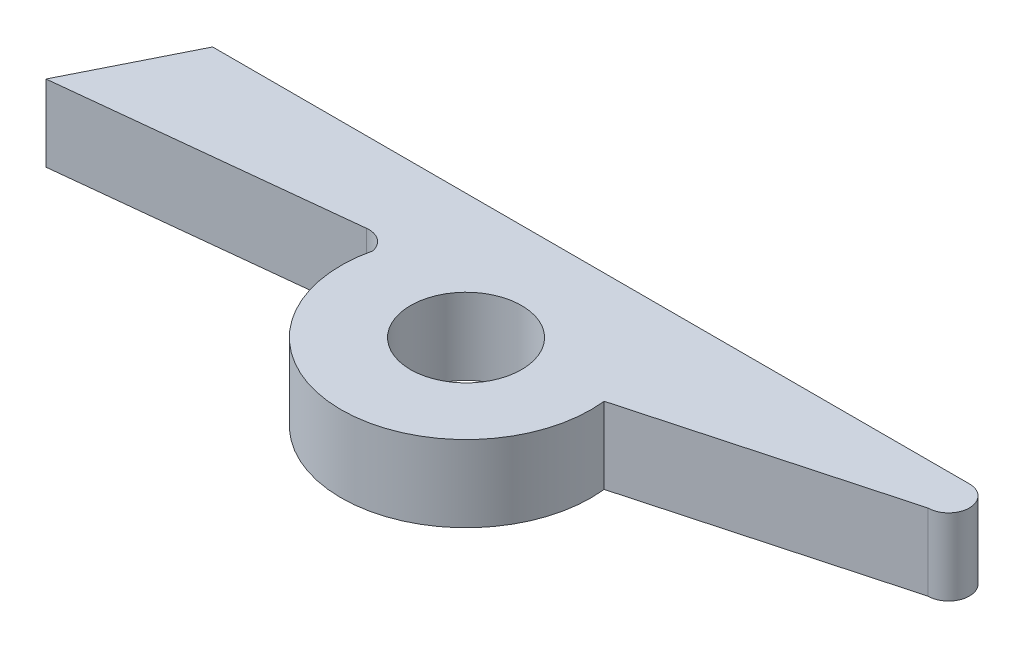
ISO-10303-21;
HEADER;
FILE_DESCRIPTION(('STEP AP214'),'2;1');
FILE_NAME('part.step','',(''),(''),'','','');
FILE_SCHEMA(('AUTOMOTIVE_DESIGN { 1 0 10303 214 1 1 1 1 }'));
ENDSEC;
DATA;
#1=APPLICATION_CONTEXT('core data for automotive mechanical design processes');
#2=APPLICATION_PROTOCOL_DEFINITION('international standard','automotive_design',2000,#1);
#3=PRODUCT_CONTEXT('',#1,'mechanical');
#4=PRODUCT('Part','Part','',(#3));
#5=PRODUCT_RELATED_PRODUCT_CATEGORY('part','',(#4));
#6=PRODUCT_DEFINITION_FORMATION('','',#4);
#7=PRODUCT_DEFINITION_CONTEXT('part definition',#1,'design');
#8=PRODUCT_DEFINITION('design','',#6,#7);
#9=PRODUCT_DEFINITION_SHAPE('','',#8);
#10=(LENGTH_UNIT() NAMED_UNIT(*) SI_UNIT(.MILLI.,.METRE.));
#11=(NAMED_UNIT(*) PLANE_ANGLE_UNIT() SI_UNIT($,.RADIAN.));
#12=(NAMED_UNIT(*) SI_UNIT($,.STERADIAN.) SOLID_ANGLE_UNIT());
#13=UNCERTAINTY_MEASURE_WITH_UNIT(LENGTH_MEASURE(1.E-05),#10,'distance_accuracy_value','');
#14=(GEOMETRIC_REPRESENTATION_CONTEXT(3) GLOBAL_UNCERTAINTY_ASSIGNED_CONTEXT((#13)) GLOBAL_UNIT_ASSIGNED_CONTEXT((#10,
#11,#12)) REPRESENTATION_CONTEXT('',''));
#15=CARTESIAN_POINT('',(0.,0.,0.));
#16=DIRECTION('',(0.,0.,1.));
#17=DIRECTION('',(1.,0.,0.));
#18=AXIS2_PLACEMENT_3D('',#15,#16,#17);
#19=CARTESIAN_POINT('',(0.36626721934757,5.5,1.3412705572508));
#20=DIRECTION('',(0.263429454612286,0.,0.964678662790192));
#21=DIRECTION('',(0.964678662790192,0.,-0.263429454612286));
#22=AXIS2_PLACEMENT_3D('',#19,#20,#21);
#23=PLANE('',#22);
#24=DIRECTION('',(-0.964678662790192,0.,0.263429454612286));
#25=VECTOR('',#24,1.);
#26=CARTESIAN_POINT('',(0.36626721934757,0.,1.3412705572508));
#27=LINE('',#26,#25);
#28=CARTESIAN_POINT('',(27.25,0.,-6.));
#29=VERTEX_POINT('',#28);
#30=CARTESIAN_POINT('',(8.94414527922395,0.,-1.0011319713883));
#31=VERTEX_POINT('',#30);
#32=EDGE_CURVE('E127',#29,#31,#27,.T.);
#33=ORIENTED_EDGE('',*,*,#32,.F.);
#34=DIRECTION('',(0.,-1.,0.));
#35=VECTOR('',#34,1.);
#36=CARTESIAN_POINT('',(27.25,5.5,-6.));
#37=LINE('',#36,#35);
#38=CARTESIAN_POINT('',(27.25,5.5,-6.));
#39=VERTEX_POINT('',#38);
#40=EDGE_CURVE('E11',#39,#29,#37,.T.);
#41=ORIENTED_EDGE('',*,*,#40,.F.);
#42=DIRECTION('',(-0.964678662790192,0.,0.263429454612286));
#43=VECTOR('',#42,1.);
#44=CARTESIAN_POINT('',(0.36626721934757,5.5,1.3412705572508));
#45=LINE('',#44,#43);
#46=CARTESIAN_POINT('',(8.94414527922395,5.5,-1.0011319713883));
#47=VERTEX_POINT('',#46);
#48=EDGE_CURVE('E165',#39,#47,#45,.T.);
#49=ORIENTED_EDGE('',*,*,#48,.T.);
#50=DIRECTION('',(0.,-1.,0.));
#51=VECTOR('',#50,1.);
#52=CARTESIAN_POINT('',(8.94414527922395,5.5,-1.0011319713883));
#53=LINE('',#52,#51);
#54=EDGE_CURVE('E83',#47,#31,#53,.T.);
#55=ORIENTED_EDGE('',*,*,#54,.T.);
#56=EDGE_LOOP('',(#33,#41,#49,#55));
#57=FACE_BOUND('',#56,.T.);
#58=ADVANCED_FACE('F35',(#57),#23,.T.);
#59=CARTESIAN_POINT('',(27.25,5.5,-7.5));
#60=DIRECTION('',(0.,-1.,0.));
#61=DIRECTION('',(0.,0.,-1.));
#62=AXIS2_PLACEMENT_3D('',#59,#60,#61);
#63=CYLINDRICAL_SURFACE('',#62,1.5);
#64=CARTESIAN_POINT('',(27.25,0.,-7.5));
#65=DIRECTION('',(0.,1.,0.));
#66=DIRECTION('',(0.,0.,1.));
#67=AXIS2_PLACEMENT_3D('',#64,#65,#66);
#68=CIRCLE('',#67,1.5);
#69=CARTESIAN_POINT('',(27.25,0.,-9.));
#70=VERTEX_POINT('',#69);
#71=EDGE_CURVE('E130',#29,#70,#68,.T.);
#72=ORIENTED_EDGE('',*,*,#71,.T.);
#73=DIRECTION('',(0.,-1.,0.));
#74=VECTOR('',#73,1.);
#75=CARTESIAN_POINT('',(27.25,5.5,-9.));
#76=LINE('',#75,#74);
#77=CARTESIAN_POINT('',(27.25,5.5,-9.));
#78=VERTEX_POINT('',#77);
#79=EDGE_CURVE('E44',#78,#70,#76,.T.);
#80=ORIENTED_EDGE('',*,*,#79,.F.);
#81=CARTESIAN_POINT('',(27.25,5.5,-7.5));
#82=DIRECTION('',(0.,1.,0.));
#83=DIRECTION('',(0.,0.,1.));
#84=AXIS2_PLACEMENT_3D('',#81,#82,#83);
#85=CIRCLE('',#84,1.5);
#86=EDGE_CURVE('E163',#39,#78,#85,.T.);
#87=ORIENTED_EDGE('',*,*,#86,.F.);
#88=ORIENTED_EDGE('',*,*,#40,.T.);
#89=EDGE_LOOP('',(#72,#80,#87,#88));
#90=FACE_BOUND('',#89,.T.);
#91=ADVANCED_FACE('F157',(#90),#63,.T.);
#92=CARTESIAN_POINT('',(0.,5.5,-9.));
#93=DIRECTION('',(0.,0.,-1.));
#94=DIRECTION('',(-1.,0.,0.));
#95=AXIS2_PLACEMENT_3D('',#92,#93,#94);
#96=PLANE('',#95);
#97=DIRECTION('',(1.,0.,0.));
#98=VECTOR('',#97,1.);
#99=CARTESIAN_POINT('',(0.,0.,-9.));
#100=LINE('',#99,#98);
#101=CARTESIAN_POINT('',(-27.25,0.,-9.));
#102=VERTEX_POINT('',#101);
#103=EDGE_CURVE('E133',#102,#70,#100,.T.);
#104=ORIENTED_EDGE('',*,*,#103,.F.);
#105=DIRECTION('',(0.,-1.,0.));
#106=VECTOR('',#105,1.);
#107=CARTESIAN_POINT('',(-27.25,5.5,-9.));
#108=LINE('',#107,#106);
#109=CARTESIAN_POINT('',(-27.25,5.5,-9.));
#110=VERTEX_POINT('',#109);
#111=EDGE_CURVE('E148',#110,#102,#108,.T.);
#112=ORIENTED_EDGE('',*,*,#111,.F.);
#113=DIRECTION('',(1.,0.,0.));
#114=VECTOR('',#113,1.);
#115=CARTESIAN_POINT('',(0.,5.5,-9.));
#116=LINE('',#115,#114);
#117=EDGE_CURVE('E154',#110,#78,#116,.T.);
#118=ORIENTED_EDGE('',*,*,#117,.T.);
#119=ORIENTED_EDGE('',*,*,#79,.T.);
#120=EDGE_LOOP('',(#104,#112,#118,#119));
#121=FACE_BOUND('',#120,.T.);
#122=ADVANCED_FACE('F153',(#121),#96,.T.);
#123=CARTESIAN_POINT('',(-25.4,5.5,-12.7));
#124=DIRECTION('',(-0.894427190999916,0.,-0.447213595499958));
#125=DIRECTION('',(-0.447213595499958,0.,0.894427190999916));
#126=AXIS2_PLACEMENT_3D('',#123,#124,#125);
#127=PLANE('',#126);
#128=DIRECTION('',(0.447213595499958,0.,-0.894427190999916));
#129=VECTOR('',#128,1.);
#130=CARTESIAN_POINT('',(-25.4,0.,-12.7));
#131=LINE('',#130,#129);
#132=CARTESIAN_POINT('',(-31.25,0.,-1.));
#133=VERTEX_POINT('',#132);
#134=EDGE_CURVE('E136',#133,#102,#131,.T.);
#135=ORIENTED_EDGE('',*,*,#134,.F.);
#136=DIRECTION('',(0.,-1.,0.));
#137=VECTOR('',#136,1.);
#138=CARTESIAN_POINT('',(-31.25,5.5,-1.));
#139=LINE('',#138,#137);
#140=CARTESIAN_POINT('',(-31.25,5.5,-1.));
#141=VERTEX_POINT('',#140);
#142=EDGE_CURVE('E110',#141,#133,#139,.T.);
#143=ORIENTED_EDGE('',*,*,#142,.F.);
#144=DIRECTION('',(0.447213595499958,0.,-0.894427190999916));
#145=VECTOR('',#144,1.);
#146=CARTESIAN_POINT('',(-25.4,5.5,-12.7));
#147=LINE('',#146,#145);
#148=EDGE_CURVE('E117',#141,#110,#147,.T.);
#149=ORIENTED_EDGE('',*,*,#148,.T.);
#150=ORIENTED_EDGE('',*,*,#111,.T.);
#151=EDGE_LOOP('',(#135,#143,#149,#150));
#152=FACE_BOUND('',#151,.T.);
#153=ADVANCED_FACE('F162',(#152),#127,.T.);
#154=CARTESIAN_POINT('',(-0.459312437672505,5.5,-4.29375088294753));
#155=DIRECTION('',(0.106365464144769,0.,0.994327103139238));
#156=DIRECTION('',(0.994327103139238,0.,-0.106365464144769));
#157=AXIS2_PLACEMENT_3D('',#154,#155,#156);
#158=PLANE('',#157);
#159=DIRECTION('',(-0.994327103139238,0.,0.106365464144769));
#160=VECTOR('',#159,1.);
#161=CARTESIAN_POINT('',(-0.459312437672505,0.,-4.29375088294753));
#162=LINE('',#161,#160);
#163=CARTESIAN_POINT('',(-10.3895481962172,0.,-3.23149065470886));
#164=VERTEX_POINT('',#163);
#165=EDGE_CURVE('E105',#164,#133,#162,.T.);
#166=ORIENTED_EDGE('',*,*,#165,.F.);
#167=DIRECTION('',(0.,-1.,0.));
#168=VECTOR('',#167,1.);
#169=CARTESIAN_POINT('',(-10.3895481962172,5.5,-3.23149065470886));
#170=LINE('',#169,#168);
#171=CARTESIAN_POINT('',(-10.3895481962172,5.5,-3.23149065470886));
#172=VERTEX_POINT('',#171);
#173=EDGE_CURVE('E100',#172,#164,#170,.T.);
#174=ORIENTED_EDGE('',*,*,#173,.F.);
#175=DIRECTION('',(-0.994327103139238,0.,0.106365464144769));
#176=VECTOR('',#175,1.);
#177=CARTESIAN_POINT('',(-0.459312437672505,5.5,-4.29375088294753));
#178=LINE('',#177,#176);
#179=EDGE_CURVE('E103',#172,#141,#178,.T.);
#180=ORIENTED_EDGE('',*,*,#179,.T.);
#181=ORIENTED_EDGE('',*,*,#142,.T.);
#182=EDGE_LOOP('',(#166,#174,#180,#181));
#183=FACE_BOUND('',#182,.T.);
#184=ADVANCED_FACE('F102',(#183),#158,.T.);
#185=CARTESIAN_POINT('',(-10.23,5.5,-1.74));
#186=DIRECTION('',(0.,-1.,0.));
#187=DIRECTION('',(0.,0.,-1.));
#188=AXIS2_PLACEMENT_3D('',#185,#186,#187);
#189=CYLINDRICAL_SURFACE('',#188,1.5);
#190=CARTESIAN_POINT('',(-10.23,0.,-1.74));
#191=DIRECTION('',(0.,1.,0.));
#192=DIRECTION('',(0.,0.,1.));
#193=AXIS2_PLACEMENT_3D('',#190,#191,#192);
#194=CIRCLE('',#193,1.5);
#195=CARTESIAN_POINT('',(-8.76287503754572,0.,-2.05232089994671));
#196=VERTEX_POINT('',#195);
#197=EDGE_CURVE('E140',#196,#164,#194,.T.);
#198=ORIENTED_EDGE('',*,*,#197,.F.);
#199=DIRECTION('',(0.,-1.,0.));
#200=VECTOR('',#199,1.);
#201=CARTESIAN_POINT('',(-8.76287503754572,5.5,-2.05232089994671));
#202=LINE('',#201,#200);
#203=CARTESIAN_POINT('',(-8.76287503754572,5.5,-2.05232089994671));
#204=VERTEX_POINT('',#203);
#205=EDGE_CURVE('E76',#204,#196,#202,.T.);
#206=ORIENTED_EDGE('',*,*,#205,.F.);
#207=CARTESIAN_POINT('',(-10.23,5.5,-1.74));
#208=DIRECTION('',(0.,1.,0.));
#209=DIRECTION('',(0.,0.,1.));
#210=AXIS2_PLACEMENT_3D('',#207,#208,#209);
#211=CIRCLE('',#210,1.5);
#212=EDGE_CURVE('E114',#204,#172,#211,.T.);
#213=ORIENTED_EDGE('',*,*,#212,.T.);
#214=ORIENTED_EDGE('',*,*,#173,.T.);
#215=EDGE_LOOP('',(#198,#206,#213,#214));
#216=FACE_BOUND('',#215,.T.);
#217=ADVANCED_FACE('F119',(#216),#189,.F.);
#218=CARTESIAN_POINT('',(0.,5.5,0.));
#219=DIRECTION('',(0.,-1.,0.));
#220=DIRECTION('',(0.,0.,-1.));
#221=AXIS2_PLACEMENT_3D('',#218,#219,#220);
#222=CYLINDRICAL_SURFACE('',#221,4.);
#223=CARTESIAN_POINT('',(0.,5.5,0.));
#224=DIRECTION('',(0.,1.,0.));
#225=DIRECTION('',(0.,0.,1.));
#226=AXIS2_PLACEMENT_3D('',#223,#224,#225);
#227=CIRCLE('',#226,4.);
#228=CARTESIAN_POINT('',(0.,5.5,4.));
#229=VERTEX_POINT('',#228);
#230=EDGE_CURVE('E144',#229,#229,#227,.T.);
#231=ORIENTED_EDGE('',*,*,#230,.T.);
#232=EDGE_LOOP('',(#231));
#233=FACE_BOUND('',#232,.T.);
#234=CARTESIAN_POINT('',(0.,0.,0.));
#235=DIRECTION('',(0.,1.,0.));
#236=DIRECTION('',(0.,0.,1.));
#237=AXIS2_PLACEMENT_3D('',#234,#235,#236);
#238=CIRCLE('',#237,4.);
#239=CARTESIAN_POINT('',(0.,0.,4.));
#240=VERTEX_POINT('',#239);
#241=EDGE_CURVE('E124',#240,#240,#238,.T.);
#242=ORIENTED_EDGE('',*,*,#241,.F.);
#243=EDGE_LOOP('',(#242));
#244=FACE_BOUND('',#243,.T.);
#245=ADVANCED_FACE('F37',(#233,#244),#222,.F.);
#246=CARTESIAN_POINT('',(0.,5.5,0.));
#247=DIRECTION('',(0.,-1.,0.));
#248=DIRECTION('',(0.,0.,-1.));
#249=AXIS2_PLACEMENT_3D('',#246,#247,#248);
#250=CYLINDRICAL_SURFACE('',#249,9.);
#251=CARTESIAN_POINT('',(0.,0.,0.));
#252=DIRECTION('',(0.,1.,0.));
#253=DIRECTION('',(0.,0.,1.));
#254=AXIS2_PLACEMENT_3D('',#251,#252,#253);
#255=CIRCLE('',#254,9.);
#256=EDGE_CURVE('E142',#196,#31,#255,.T.);
#257=ORIENTED_EDGE('',*,*,#256,.T.);
#258=ORIENTED_EDGE('',*,*,#54,.F.);
#259=CARTESIAN_POINT('',(0.,5.5,0.));
#260=DIRECTION('',(0.,1.,0.));
#261=DIRECTION('',(0.,0.,1.));
#262=AXIS2_PLACEMENT_3D('',#259,#260,#261);
#263=CIRCLE('',#262,9.);
#264=EDGE_CURVE('E52',#204,#47,#263,.T.);
#265=ORIENTED_EDGE('',*,*,#264,.F.);
#266=ORIENTED_EDGE('',*,*,#205,.T.);
#267=EDGE_LOOP('',(#257,#258,#265,#266));
#268=FACE_BOUND('',#267,.T.);
#269=ADVANCED_FACE('F175',(#268),#250,.T.);
#270=CARTESIAN_POINT('',(0.,5.5,0.));
#271=DIRECTION('',(0.,1.,0.));
#272=DIRECTION('',(0.,0.,1.));
#273=AXIS2_PLACEMENT_3D('',#270,#271,#272);
#274=PLANE('',#273);
#275=ORIENTED_EDGE('',*,*,#230,.F.);
#276=EDGE_LOOP('',(#275));
#277=FACE_BOUND('',#276,.T.);
#278=ORIENTED_EDGE('',*,*,#48,.F.);
#279=ORIENTED_EDGE('',*,*,#86,.T.);
#280=ORIENTED_EDGE('',*,*,#117,.F.);
#281=ORIENTED_EDGE('',*,*,#148,.F.);
#282=ORIENTED_EDGE('',*,*,#179,.F.);
#283=ORIENTED_EDGE('',*,*,#212,.F.);
#284=ORIENTED_EDGE('',*,*,#264,.T.);
#285=EDGE_LOOP('',(#278,#279,#280,#281,#282,#283,#284));
#286=FACE_BOUND('',#285,.T.);
#287=ADVANCED_FACE('F113',(#277,#286),#274,.T.);
#288=CARTESIAN_POINT('',(0.,0.,0.));
#289=DIRECTION('',(0.,1.,0.));
#290=DIRECTION('',(0.,0.,1.));
#291=AXIS2_PLACEMENT_3D('',#288,#289,#290);
#292=PLANE('',#291);
#293=ORIENTED_EDGE('',*,*,#241,.T.);
#294=EDGE_LOOP('',(#293));
#295=FACE_BOUND('',#294,.T.);
#296=ORIENTED_EDGE('',*,*,#32,.T.);
#297=ORIENTED_EDGE('',*,*,#256,.F.);
#298=ORIENTED_EDGE('',*,*,#197,.T.);
#299=ORIENTED_EDGE('',*,*,#165,.T.);
#300=ORIENTED_EDGE('',*,*,#134,.T.);
#301=ORIENTED_EDGE('',*,*,#103,.T.);
#302=ORIENTED_EDGE('',*,*,#71,.F.);
#303=EDGE_LOOP('',(#296,#297,#298,#299,#300,#301,#302));
#304=FACE_BOUND('',#303,.T.);
#305=ADVANCED_FACE('F159',(#295,#304),#292,.F.);
#306=CLOSED_SHELL('',(#58,#91,#122,#153,#184,#217,#245,#269,#287,#305));
#307=MANIFOLD_SOLID_BREP('B2',#306);
#308=ADVANCED_BREP_SHAPE_REPRESENTATION('',(#18,#307),#14);
#309=SHAPE_DEFINITION_REPRESENTATION(#9,#308);
ENDSEC;
END-ISO-10303-21;
